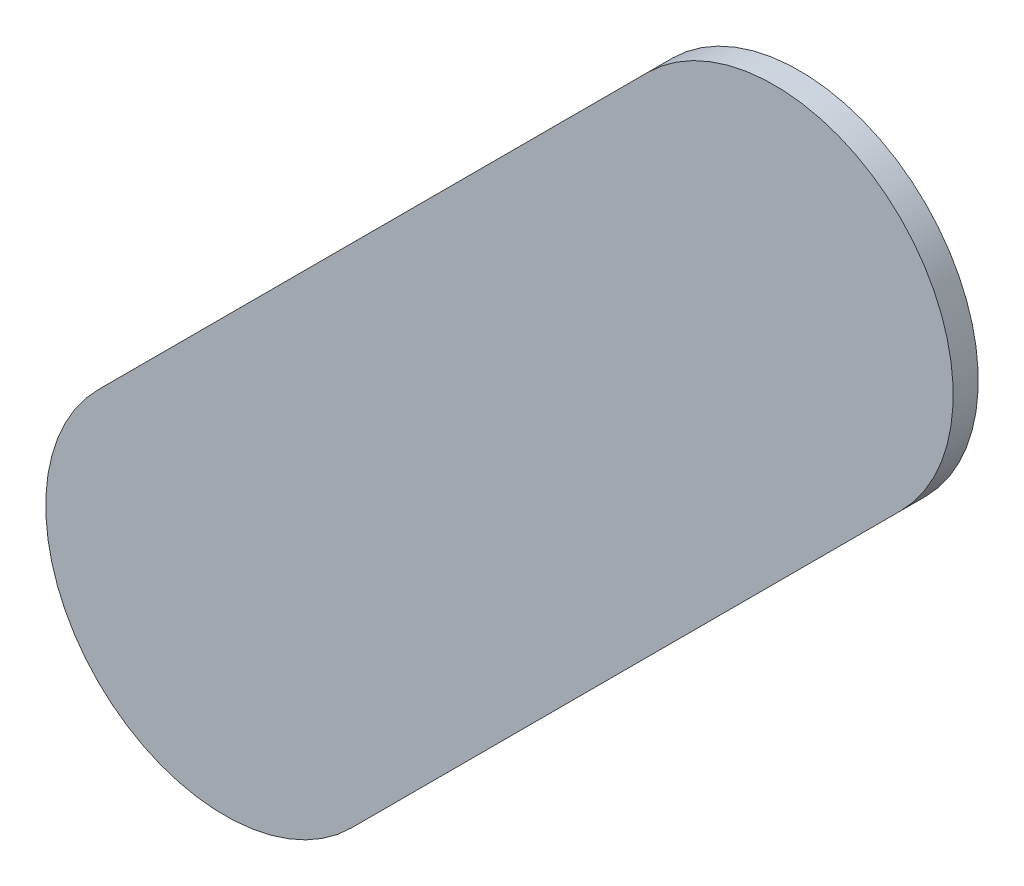
ISO-10303-21;
HEADER;
FILE_DESCRIPTION(('STEP AP214'),'2;1');
FILE_NAME('part.step','',(''),(''),'','','');
FILE_SCHEMA(('AUTOMOTIVE_DESIGN { 1 0 10303 214 1 1 1 1 }'));
ENDSEC;
DATA;
#1=APPLICATION_CONTEXT('core data for automotive mechanical design processes');
#2=APPLICATION_PROTOCOL_DEFINITION('international standard','automotive_design',2000,#1);
#3=PRODUCT_CONTEXT('',#1,'mechanical');
#4=PRODUCT('Part','Part','',(#3));
#5=PRODUCT_RELATED_PRODUCT_CATEGORY('part','',(#4));
#6=PRODUCT_DEFINITION_FORMATION('','',#4);
#7=PRODUCT_DEFINITION_CONTEXT('part definition',#1,'design');
#8=PRODUCT_DEFINITION('design','',#6,#7);
#9=PRODUCT_DEFINITION_SHAPE('','',#8);
#10=(LENGTH_UNIT() NAMED_UNIT(*) SI_UNIT(.MILLI.,.METRE.));
#11=(NAMED_UNIT(*) PLANE_ANGLE_UNIT() SI_UNIT($,.RADIAN.));
#12=(NAMED_UNIT(*) SI_UNIT($,.STERADIAN.) SOLID_ANGLE_UNIT());
#13=UNCERTAINTY_MEASURE_WITH_UNIT(LENGTH_MEASURE(1.E-05),#10,'distance_accuracy_value','');
#14=(GEOMETRIC_REPRESENTATION_CONTEXT(3) GLOBAL_UNCERTAINTY_ASSIGNED_CONTEXT((#13)) GLOBAL_UNIT_ASSIGNED_CONTEXT((#10,
#11,#12)) REPRESENTATION_CONTEXT('',''));
#15=CARTESIAN_POINT('',(0.,0.,0.));
#16=DIRECTION('',(0.,0.,1.));
#17=DIRECTION('',(1.,0.,0.));
#18=AXIS2_PLACEMENT_3D('',#15,#16,#17);
#19=CARTESIAN_POINT('',(134.570847,-111.063223,1.635));
#20=DIRECTION('',(0.,0.,1.));
#21=DIRECTION('',(1.,0.,0.));
#22=AXIS2_PLACEMENT_3D('',#19,#20,#21);
#23=PLANE('',#22);
#24=DIRECTION('',(-0.707106781186548,-0.707106781186548,0.));
#25=VECTOR('',#24,1.);
#26=CARTESIAN_POINT('',(134.570847,-111.063223,1.635));
#27=LINE('',#26,#25);
#28=CARTESIAN_POINT('',(134.570847,-111.063223,1.635));
#29=VERTEX_POINT('',#28);
#30=CARTESIAN_POINT('',(133.803223,-111.830847,1.635));
#31=VERTEX_POINT('',#30);
#32=EDGE_CURVE('E82',#29,#31,#27,.T.);
#33=ORIENTED_EDGE('',*,*,#32,.T.);
#34=CARTESIAN_POINT('',(133.9799995,-112.0076235,1.635));
#35=DIRECTION('',(0.,0.,1.));
#36=DIRECTION('',(-0.707106781187048,0.707106781186048,0.));
#37=AXIS2_PLACEMENT_3D('',#34,#35,#36);
#38=CIRCLE('',#37,0.249999723809);
#39=CARTESIAN_POINT('',(134.156776,-112.1844,1.635));
#40=VERTEX_POINT('',#39);
#41=EDGE_CURVE('E98',#31,#40,#38,.T.);
#42=ORIENTED_EDGE('',*,*,#41,.T.);
#43=DIRECTION('',(0.707106781186548,0.707106781186548,0.));
#44=VECTOR('',#43,1.);
#45=CARTESIAN_POINT('',(134.156776,-112.1844,1.635));
#46=LINE('',#45,#44);
#47=CARTESIAN_POINT('',(134.9244,-111.416776,1.635));
#48=VERTEX_POINT('',#47);
#49=EDGE_CURVE('E75',#40,#48,#46,.T.);
#50=ORIENTED_EDGE('',*,*,#49,.T.);
#51=CARTESIAN_POINT('',(134.7476235,-111.2399995,1.635));
#52=DIRECTION('',(0.,0.,1.));
#53=DIRECTION('',(0.707106781186548,-0.707106781186548,0.));
#54=AXIS2_PLACEMENT_3D('',#51,#52,#53);
#55=CIRCLE('',#54,0.249999723809);
#56=EDGE_CURVE('E11',#48,#29,#55,.T.);
#57=ORIENTED_EDGE('',*,*,#56,.T.);
#58=EDGE_LOOP('',(#33,#42,#50,#57));
#59=FACE_BOUND('',#58,.T.);
#60=ADVANCED_FACE('F17',(#59),#23,.T.);
#61=CARTESIAN_POINT('',(134.570847,-111.063223,1.6));
#62=DIRECTION('',(0.,0.,1.));
#63=DIRECTION('',(1.,0.,0.));
#64=AXIS2_PLACEMENT_3D('',#61,#62,#63);
#65=PLANE('',#64);
#66=CARTESIAN_POINT('',(134.7476235,-111.2399995,1.6));
#67=DIRECTION('',(0.,0.,1.));
#68=DIRECTION('',(0.707106781186548,-0.707106781186548,0.));
#69=AXIS2_PLACEMENT_3D('',#66,#67,#68);
#70=CIRCLE('',#69,0.249999723809);
#71=CARTESIAN_POINT('',(134.9244,-111.416776,1.6));
#72=VERTEX_POINT('',#71);
#73=CARTESIAN_POINT('',(134.570847,-111.063223,1.6));
#74=VERTEX_POINT('',#73);
#75=EDGE_CURVE('E20',#72,#74,#70,.T.);
#76=ORIENTED_EDGE('',*,*,#75,.F.);
#77=DIRECTION('',(0.707106781186548,0.707106781186548,0.));
#78=VECTOR('',#77,1.);
#79=CARTESIAN_POINT('',(134.156776,-112.1844,1.6));
#80=LINE('',#79,#78);
#81=CARTESIAN_POINT('',(134.156776,-112.1844,1.6));
#82=VERTEX_POINT('',#81);
#83=EDGE_CURVE('E101',#82,#72,#80,.T.);
#84=ORIENTED_EDGE('',*,*,#83,.F.);
#85=CARTESIAN_POINT('',(133.9799995,-112.0076235,1.6));
#86=DIRECTION('',(0.,0.,1.));
#87=DIRECTION('',(-0.707106781187048,0.707106781186048,0.));
#88=AXIS2_PLACEMENT_3D('',#85,#86,#87);
#89=CIRCLE('',#88,0.249999723809);
#90=CARTESIAN_POINT('',(133.803223,-111.830847,1.6));
#91=VERTEX_POINT('',#90);
#92=EDGE_CURVE('E84',#91,#82,#89,.T.);
#93=ORIENTED_EDGE('',*,*,#92,.F.);
#94=DIRECTION('',(-0.707106781186548,-0.707106781186548,0.));
#95=VECTOR('',#94,1.);
#96=CARTESIAN_POINT('',(134.570847,-111.063223,1.6));
#97=LINE('',#96,#95);
#98=EDGE_CURVE('E80',#74,#91,#97,.T.);
#99=ORIENTED_EDGE('',*,*,#98,.F.);
#100=EDGE_LOOP('',(#76,#84,#93,#99));
#101=FACE_BOUND('',#100,.T.);
#102=ADVANCED_FACE('F86',(#101),#65,.F.);
#103=CARTESIAN_POINT('',(134.7476235,-111.2399995,1.6));
#104=DIRECTION('',(0.,0.,-1.));
#105=DIRECTION('',(0.707106781186548,-0.707106781186548,0.));
#106=AXIS2_PLACEMENT_3D('',#103,#104,#105);
#107=CYLINDRICAL_SURFACE('',#106,0.249999723809);
#108=ORIENTED_EDGE('',*,*,#75,.T.);
#109=DIRECTION('',(0.,0.,1.));
#110=VECTOR('',#109,1.);
#111=CARTESIAN_POINT('',(134.570847,-111.063223,1.6));
#112=LINE('',#111,#110);
#113=EDGE_CURVE('E69',#74,#29,#112,.T.);
#114=ORIENTED_EDGE('',*,*,#113,.T.);
#115=ORIENTED_EDGE('',*,*,#56,.F.);
#116=DIRECTION('',(0.,0.,1.));
#117=VECTOR('',#116,1.);
#118=CARTESIAN_POINT('',(134.9244,-111.416776,1.6));
#119=LINE('',#118,#117);
#120=EDGE_CURVE('E72',#72,#48,#119,.T.);
#121=ORIENTED_EDGE('',*,*,#120,.F.);
#122=EDGE_LOOP('',(#108,#114,#115,#121));
#123=FACE_BOUND('',#122,.T.);
#124=ADVANCED_FACE('F68',(#123),#107,.T.);
#125=CARTESIAN_POINT('',(134.156776,-112.1844,1.6));
#126=DIRECTION('',(-0.707106781186548,0.707106781186548,0.));
#127=DIRECTION('',(0.,0.,1.));
#128=AXIS2_PLACEMENT_3D('',#125,#126,#127);
#129=PLANE('',#128);
#130=ORIENTED_EDGE('',*,*,#83,.T.);
#131=ORIENTED_EDGE('',*,*,#120,.T.);
#132=ORIENTED_EDGE('',*,*,#49,.F.);
#133=DIRECTION('',(0.,0.,1.));
#134=VECTOR('',#133,1.);
#135=CARTESIAN_POINT('',(134.156776,-112.1844,1.6));
#136=LINE('',#135,#134);
#137=EDGE_CURVE('E102',#82,#40,#136,.T.);
#138=ORIENTED_EDGE('',*,*,#137,.F.);
#139=EDGE_LOOP('',(#130,#131,#132,#138));
#140=FACE_BOUND('',#139,.T.);
#141=ADVANCED_FACE('F120',(#140),#129,.F.);
#142=CARTESIAN_POINT('',(133.9799995,-112.0076235,1.6));
#143=DIRECTION('',(0.,0.,-1.));
#144=DIRECTION('',(-0.707106781187048,0.707106781186048,0.));
#145=AXIS2_PLACEMENT_3D('',#142,#143,#144);
#146=CYLINDRICAL_SURFACE('',#145,0.249999723809);
#147=ORIENTED_EDGE('',*,*,#92,.T.);
#148=ORIENTED_EDGE('',*,*,#137,.T.);
#149=ORIENTED_EDGE('',*,*,#41,.F.);
#150=DIRECTION('',(0.,0.,1.));
#151=VECTOR('',#150,1.);
#152=CARTESIAN_POINT('',(133.803223,-111.830847,1.6));
#153=LINE('',#152,#151);
#154=EDGE_CURVE('E90',#91,#31,#153,.T.);
#155=ORIENTED_EDGE('',*,*,#154,.F.);
#156=EDGE_LOOP('',(#147,#148,#149,#155));
#157=FACE_BOUND('',#156,.T.);
#158=ADVANCED_FACE('F122',(#157),#146,.T.);
#159=CARTESIAN_POINT('',(134.570847,-111.063223,1.6));
#160=DIRECTION('',(0.707106781186548,-0.707106781186548,0.));
#161=DIRECTION('',(0.,0.,-1.));
#162=AXIS2_PLACEMENT_3D('',#159,#160,#161);
#163=PLANE('',#162);
#164=ORIENTED_EDGE('',*,*,#98,.T.);
#165=ORIENTED_EDGE('',*,*,#154,.T.);
#166=ORIENTED_EDGE('',*,*,#32,.F.);
#167=ORIENTED_EDGE('',*,*,#113,.F.);
#168=EDGE_LOOP('',(#164,#165,#166,#167));
#169=FACE_BOUND('',#168,.T.);
#170=ADVANCED_FACE('F78',(#169),#163,.F.);
#171=CLOSED_SHELL('',(#60,#102,#124,#141,#158,#170));
#172=MANIFOLD_SOLID_BREP('B1',#171);
#173=ADVANCED_BREP_SHAPE_REPRESENTATION('',(#18,#172),#14);
#174=SHAPE_DEFINITION_REPRESENTATION(#9,#173);
ENDSEC;
END-ISO-10303-21;
